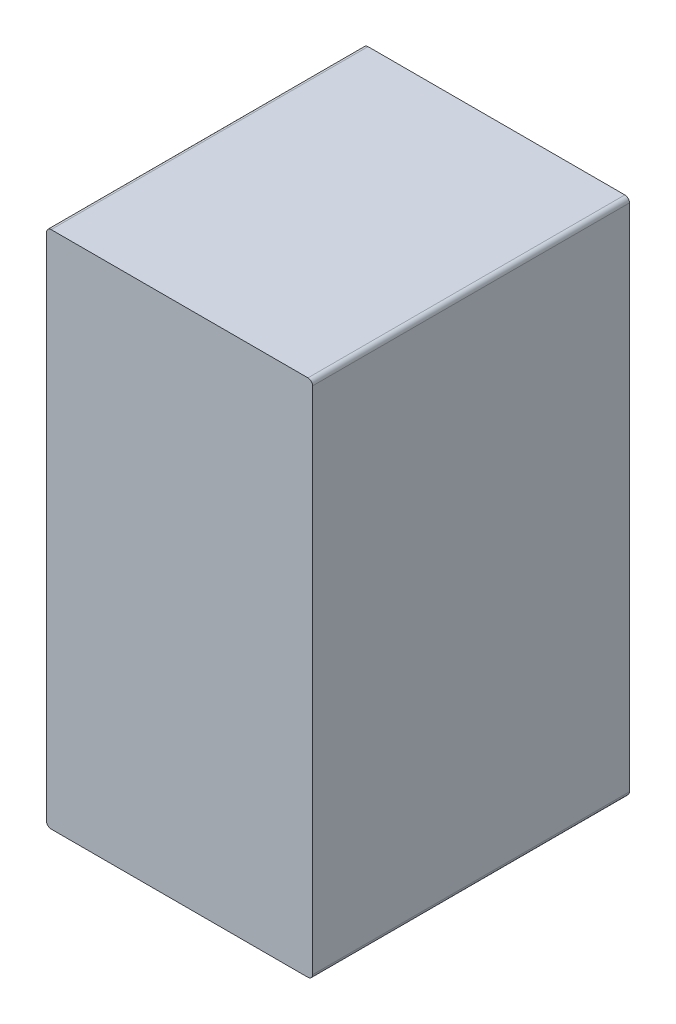
ISO-10303-21;
HEADER;
FILE_DESCRIPTION(('STEP AP214'),'2;1');
FILE_NAME('part.step','',(''),(''),'','','');
FILE_SCHEMA(('AUTOMOTIVE_DESIGN { 1 0 10303 214 1 1 1 1 }'));
ENDSEC;
DATA;
#1=APPLICATION_CONTEXT('core data for automotive mechanical design processes');
#2=APPLICATION_PROTOCOL_DEFINITION('international standard','automotive_design',2000,#1);
#3=PRODUCT_CONTEXT('',#1,'mechanical');
#4=PRODUCT('Part','Part','',(#3));
#5=PRODUCT_RELATED_PRODUCT_CATEGORY('part','',(#4));
#6=PRODUCT_DEFINITION_FORMATION('','',#4);
#7=PRODUCT_DEFINITION_CONTEXT('part definition',#1,'design');
#8=PRODUCT_DEFINITION('design','',#6,#7);
#9=PRODUCT_DEFINITION_SHAPE('','',#8);
#10=(LENGTH_UNIT() NAMED_UNIT(*) SI_UNIT(.MILLI.,.METRE.));
#11=(NAMED_UNIT(*) PLANE_ANGLE_UNIT() SI_UNIT($,.RADIAN.));
#12=(NAMED_UNIT(*) SI_UNIT($,.STERADIAN.) SOLID_ANGLE_UNIT());
#13=UNCERTAINTY_MEASURE_WITH_UNIT(LENGTH_MEASURE(1.E-05),#10,'distance_accuracy_value','');
#14=(GEOMETRIC_REPRESENTATION_CONTEXT(3) GLOBAL_UNCERTAINTY_ASSIGNED_CONTEXT((#13)) GLOBAL_UNIT_ASSIGNED_CONTEXT((#10,
#11,#12)) REPRESENTATION_CONTEXT('',''));
#15=CARTESIAN_POINT('',(0.,0.,0.));
#16=DIRECTION('',(0.,0.,1.));
#17=DIRECTION('',(1.,0.,0.));
#18=AXIS2_PLACEMENT_3D('',#15,#16,#17);
#19=CARTESIAN_POINT('',(69.5,138.,170.));
#20=DIRECTION('',(0.,0.,-1.));
#21=DIRECTION('',(-1.,0.,0.));
#22=AXIS2_PLACEMENT_3D('',#19,#20,#21);
#23=CYLINDRICAL_SURFACE('',#22,2.5);
#24=CARTESIAN_POINT('',(69.5,138.,0.));
#25=DIRECTION('',(0.,0.,1.));
#26=DIRECTION('',(1.,0.,0.));
#27=AXIS2_PLACEMENT_3D('',#24,#25,#26);
#28=CIRCLE('',#27,2.5);
#29=CARTESIAN_POINT('',(69.4999999999999,140.5,0.));
#30=VERTEX_POINT('',#29);
#31=CARTESIAN_POINT('',(72.,138.,0.));
#32=VERTEX_POINT('',#31);
#33=EDGE_CURVE('E198',#30,#32,#28,.F.);
#34=ORIENTED_EDGE('',*,*,#33,.F.);
#35=DIRECTION('',(0.,0.,-1.));
#36=VECTOR('',#35,1.);
#37=CARTESIAN_POINT('',(69.4999999999999,140.5,170.));
#38=LINE('',#37,#36);
#39=CARTESIAN_POINT('',(69.4999999999999,140.5,171.5));
#40=VERTEX_POINT('',#39);
#41=EDGE_CURVE('E11',#40,#30,#38,.T.);
#42=ORIENTED_EDGE('',*,*,#41,.F.);
#43=CARTESIAN_POINT('',(69.5,138.,171.5));
#44=DIRECTION('',(0.,0.,1.));
#45=DIRECTION('',(1.,0.,0.));
#46=AXIS2_PLACEMENT_3D('',#43,#44,#45);
#47=CIRCLE('',#46,2.5);
#48=CARTESIAN_POINT('',(72.,138.,171.5));
#49=VERTEX_POINT('',#48);
#50=EDGE_CURVE('E275',#49,#40,#47,.T.);
#51=ORIENTED_EDGE('',*,*,#50,.F.);
#52=DIRECTION('',(0.,0.,-1.));
#53=VECTOR('',#52,1.);
#54=CARTESIAN_POINT('',(72.,138.,170.));
#55=LINE('',#54,#53);
#56=EDGE_CURVE('E119',#49,#32,#55,.T.);
#57=ORIENTED_EDGE('',*,*,#56,.T.);
#58=EDGE_LOOP('',(#34,#42,#51,#57));
#59=FACE_BOUND('',#58,.T.);
#60=ADVANCED_FACE('F39',(#59),#23,.T.);
#61=CARTESIAN_POINT('',(0.,140.5,170.));
#62=DIRECTION('',(0.,-1.,0.));
#63=DIRECTION('',(0.,0.,-1.));
#64=AXIS2_PLACEMENT_3D('',#61,#62,#63);
#65=PLANE('',#64);
#66=DIRECTION('',(-1.,0.,0.));
#67=VECTOR('',#66,1.);
#68=CARTESIAN_POINT('',(0.,140.5,0.));
#69=LINE('',#68,#67);
#70=CARTESIAN_POINT('',(-69.5,140.5,0.));
#71=VERTEX_POINT('',#70);
#72=EDGE_CURVE('E200',#30,#71,#69,.T.);
#73=ORIENTED_EDGE('',*,*,#72,.T.);
#74=DIRECTION('',(0.,0.,-1.));
#75=VECTOR('',#74,1.);
#76=CARTESIAN_POINT('',(-69.5,140.5,170.));
#77=LINE('',#76,#75);
#78=CARTESIAN_POINT('',(-69.4999999999999,140.5,171.5));
#79=VERTEX_POINT('',#78);
#80=EDGE_CURVE('E49',#79,#71,#77,.T.);
#81=ORIENTED_EDGE('',*,*,#80,.F.);
#82=DIRECTION('',(-1.,0.,0.));
#83=VECTOR('',#82,1.);
#84=CARTESIAN_POINT('',(-69.4999999999999,140.5,171.5));
#85=LINE('',#84,#83);
#86=EDGE_CURVE('E272',#40,#79,#85,.T.);
#87=ORIENTED_EDGE('',*,*,#86,.F.);
#88=ORIENTED_EDGE('',*,*,#41,.T.);
#89=EDGE_LOOP('',(#73,#81,#87,#88));
#90=FACE_BOUND('',#89,.T.);
#91=ADVANCED_FACE('F318',(#90),#65,.F.);
#92=CARTESIAN_POINT('',(-69.5,138.,170.));
#93=DIRECTION('',(0.,0.,-1.));
#94=DIRECTION('',(-1.,0.,0.));
#95=AXIS2_PLACEMENT_3D('',#92,#93,#94);
#96=CYLINDRICAL_SURFACE('',#95,2.5);
#97=CARTESIAN_POINT('',(-69.5,138.,0.));
#98=DIRECTION('',(0.,0.,1.));
#99=DIRECTION('',(1.,0.,0.));
#100=AXIS2_PLACEMENT_3D('',#97,#98,#99);
#101=CIRCLE('',#100,2.5);
#102=CARTESIAN_POINT('',(-72.,138.,0.));
#103=VERTEX_POINT('',#102);
#104=EDGE_CURVE('E203',#103,#71,#101,.F.);
#105=ORIENTED_EDGE('',*,*,#104,.F.);
#106=DIRECTION('',(0.,0.,-1.));
#107=VECTOR('',#106,1.);
#108=CARTESIAN_POINT('',(-72.,138.,170.));
#109=LINE('',#108,#107);
#110=CARTESIAN_POINT('',(-72.,138.,171.5));
#111=VERTEX_POINT('',#110);
#112=EDGE_CURVE('E230',#111,#103,#109,.T.);
#113=ORIENTED_EDGE('',*,*,#112,.F.);
#114=CARTESIAN_POINT('',(-69.5,138.,171.5));
#115=DIRECTION('',(0.,0.,1.));
#116=DIRECTION('',(1.,0.,0.));
#117=AXIS2_PLACEMENT_3D('',#114,#115,#116);
#118=CIRCLE('',#117,2.5);
#119=EDGE_CURVE('E269',#79,#111,#118,.T.);
#120=ORIENTED_EDGE('',*,*,#119,.F.);
#121=ORIENTED_EDGE('',*,*,#80,.T.);
#122=EDGE_LOOP('',(#105,#113,#120,#121));
#123=FACE_BOUND('',#122,.T.);
#124=ADVANCED_FACE('F321',(#123),#96,.T.);
#125=CARTESIAN_POINT('',(-72.,0.,170.));
#126=DIRECTION('',(1.,0.,0.));
#127=DIRECTION('',(0.,0.,-1.));
#128=AXIS2_PLACEMENT_3D('',#125,#126,#127);
#129=PLANE('',#128);
#130=DIRECTION('',(0.,-1.,0.));
#131=VECTOR('',#130,1.);
#132=CARTESIAN_POINT('',(-72.,0.,0.));
#133=LINE('',#132,#131);
#134=CARTESIAN_POINT('',(-72.,-138.,0.));
#135=VERTEX_POINT('',#134);
#136=EDGE_CURVE('E206',#103,#135,#133,.T.);
#137=ORIENTED_EDGE('',*,*,#136,.T.);
#138=DIRECTION('',(0.,0.,-1.));
#139=VECTOR('',#138,1.);
#140=CARTESIAN_POINT('',(-72.,-138.,170.));
#141=LINE('',#140,#139);
#142=CARTESIAN_POINT('',(-72.,-138.,171.5));
#143=VERTEX_POINT('',#142);
#144=EDGE_CURVE('E227',#143,#135,#141,.T.);
#145=ORIENTED_EDGE('',*,*,#144,.F.);
#146=DIRECTION('',(0.,-1.,0.));
#147=VECTOR('',#146,1.);
#148=CARTESIAN_POINT('',(-72.,-138.,171.5));
#149=LINE('',#148,#147);
#150=EDGE_CURVE('E266',#111,#143,#149,.T.);
#151=ORIENTED_EDGE('',*,*,#150,.F.);
#152=ORIENTED_EDGE('',*,*,#112,.T.);
#153=EDGE_LOOP('',(#137,#145,#151,#152));
#154=FACE_BOUND('',#153,.T.);
#155=ADVANCED_FACE('F325',(#154),#129,.F.);
#156=CARTESIAN_POINT('',(-69.5,-138.,170.));
#157=DIRECTION('',(0.,0.,-1.));
#158=DIRECTION('',(-1.,0.,0.));
#159=AXIS2_PLACEMENT_3D('',#156,#157,#158);
#160=CYLINDRICAL_SURFACE('',#159,2.5);
#161=CARTESIAN_POINT('',(-69.5,-138.,0.));
#162=DIRECTION('',(0.,0.,1.));
#163=DIRECTION('',(1.,0.,0.));
#164=AXIS2_PLACEMENT_3D('',#161,#162,#163);
#165=CIRCLE('',#164,2.5);
#166=CARTESIAN_POINT('',(-69.5,-140.5,0.));
#167=VERTEX_POINT('',#166);
#168=EDGE_CURVE('E209',#135,#167,#165,.T.);
#169=ORIENTED_EDGE('',*,*,#168,.T.);
#170=DIRECTION('',(0.,0.,-1.));
#171=VECTOR('',#170,1.);
#172=CARTESIAN_POINT('',(-69.5,-140.5,170.));
#173=LINE('',#172,#171);
#174=CARTESIAN_POINT('',(-69.4999999999999,-140.5,171.5));
#175=VERTEX_POINT('',#174);
#176=EDGE_CURVE('E225',#175,#167,#173,.T.);
#177=ORIENTED_EDGE('',*,*,#176,.F.);
#178=CARTESIAN_POINT('',(-69.5,-138.,171.5));
#179=DIRECTION('',(0.,0.,1.));
#180=DIRECTION('',(-1.,0.,0.));
#181=AXIS2_PLACEMENT_3D('',#178,#179,#180);
#182=CIRCLE('',#181,2.5);
#183=EDGE_CURVE('E263',#143,#175,#182,.T.);
#184=ORIENTED_EDGE('',*,*,#183,.F.);
#185=ORIENTED_EDGE('',*,*,#144,.T.);
#186=EDGE_LOOP('',(#169,#177,#184,#185));
#187=FACE_BOUND('',#186,.T.);
#188=ADVANCED_FACE('F328',(#187),#160,.T.);
#189=CARTESIAN_POINT('',(0.,-140.5,170.));
#190=DIRECTION('',(0.,-1.,0.));
#191=DIRECTION('',(0.,0.,-1.));
#192=AXIS2_PLACEMENT_3D('',#189,#190,#191);
#193=PLANE('',#192);
#194=DIRECTION('',(-1.,0.,0.));
#195=VECTOR('',#194,1.);
#196=CARTESIAN_POINT('',(0.,-140.5,0.));
#197=LINE('',#196,#195);
#198=CARTESIAN_POINT('',(69.4999999999999,-140.5,0.));
#199=VERTEX_POINT('',#198);
#200=EDGE_CURVE('E212',#199,#167,#197,.T.);
#201=ORIENTED_EDGE('',*,*,#200,.F.);
#202=DIRECTION('',(0.,0.,-1.));
#203=VECTOR('',#202,1.);
#204=CARTESIAN_POINT('',(69.4999999999999,-140.5,170.));
#205=LINE('',#204,#203);
#206=CARTESIAN_POINT('',(69.4999999999999,-140.5,171.5));
#207=VERTEX_POINT('',#206);
#208=EDGE_CURVE('E223',#207,#199,#205,.T.);
#209=ORIENTED_EDGE('',*,*,#208,.F.);
#210=DIRECTION('',(1.,0.,0.));
#211=VECTOR('',#210,1.);
#212=CARTESIAN_POINT('',(-69.4999999999999,-140.5,171.5));
#213=LINE('',#212,#211);
#214=EDGE_CURVE('E182',#175,#207,#213,.T.);
#215=ORIENTED_EDGE('',*,*,#214,.F.);
#216=ORIENTED_EDGE('',*,*,#176,.T.);
#217=EDGE_LOOP('',(#201,#209,#215,#216));
#218=FACE_BOUND('',#217,.T.);
#219=ADVANCED_FACE('F329',(#218),#193,.T.);
#220=CARTESIAN_POINT('',(69.5,-138.,170.));
#221=DIRECTION('',(0.,0.,-1.));
#222=DIRECTION('',(-1.,0.,0.));
#223=AXIS2_PLACEMENT_3D('',#220,#221,#222);
#224=CYLINDRICAL_SURFACE('',#223,2.5);
#225=CARTESIAN_POINT('',(69.5,-138.,0.));
#226=DIRECTION('',(0.,0.,1.));
#227=DIRECTION('',(1.,0.,0.));
#228=AXIS2_PLACEMENT_3D('',#225,#226,#227);
#229=CIRCLE('',#228,2.5);
#230=CARTESIAN_POINT('',(72.,-138.,0.));
#231=VERTEX_POINT('',#230);
#232=EDGE_CURVE('E215',#199,#231,#229,.T.);
#233=ORIENTED_EDGE('',*,*,#232,.T.);
#234=DIRECTION('',(0.,0.,-1.));
#235=VECTOR('',#234,1.);
#236=CARTESIAN_POINT('',(72.,-138.,170.));
#237=LINE('',#236,#235);
#238=CARTESIAN_POINT('',(72.,-138.,171.5));
#239=VERTEX_POINT('',#238);
#240=EDGE_CURVE('E111',#239,#231,#237,.T.);
#241=ORIENTED_EDGE('',*,*,#240,.F.);
#242=CARTESIAN_POINT('',(69.5,-138.,171.5));
#243=DIRECTION('',(0.,0.,1.));
#244=DIRECTION('',(1.,0.,0.));
#245=AXIS2_PLACEMENT_3D('',#242,#243,#244);
#246=CIRCLE('',#245,2.5);
#247=EDGE_CURVE('E281',#207,#239,#246,.T.);
#248=ORIENTED_EDGE('',*,*,#247,.F.);
#249=ORIENTED_EDGE('',*,*,#208,.T.);
#250=EDGE_LOOP('',(#233,#241,#248,#249));
#251=FACE_BOUND('',#250,.T.);
#252=ADVANCED_FACE('F292',(#251),#224,.T.);
#253=CARTESIAN_POINT('',(-69.5,138.,170.));
#254=DIRECTION('',(0.,0.,-1.));
#255=DIRECTION('',(-1.,0.,0.));
#256=AXIS2_PLACEMENT_3D('',#253,#254,#255);
#257=CYLINDRICAL_SURFACE('',#256,1.);
#258=CARTESIAN_POINT('',(-69.5,138.,0.));
#259=DIRECTION('',(0.,0.,1.));
#260=DIRECTION('',(1.,0.,0.));
#261=AXIS2_PLACEMENT_3D('',#258,#259,#260);
#262=CIRCLE('',#261,1.);
#263=CARTESIAN_POINT('',(-70.5,138.,0.));
#264=VERTEX_POINT('',#263);
#265=CARTESIAN_POINT('',(-69.5,139.,0.));
#266=VERTEX_POINT('',#265);
#267=EDGE_CURVE('E178',#264,#266,#262,.F.);
#268=ORIENTED_EDGE('',*,*,#267,.T.);
#269=DIRECTION('',(0.,0.,-1.));
#270=VECTOR('',#269,1.);
#271=CARTESIAN_POINT('',(-69.5,139.,170.));
#272=LINE('',#271,#270);
#273=CARTESIAN_POINT('',(-69.5,139.,170.));
#274=VERTEX_POINT('',#273);
#275=EDGE_CURVE('E43',#274,#266,#272,.T.);
#276=ORIENTED_EDGE('',*,*,#275,.F.);
#277=CARTESIAN_POINT('',(-69.5,138.,170.));
#278=DIRECTION('',(0.,0.,1.));
#279=DIRECTION('',(1.,0.,0.));
#280=AXIS2_PLACEMENT_3D('',#277,#278,#279);
#281=CIRCLE('',#280,1.);
#282=CARTESIAN_POINT('',(-70.5,138.,170.));
#283=VERTEX_POINT('',#282);
#284=EDGE_CURVE('E220',#283,#274,#281,.F.);
#285=ORIENTED_EDGE('',*,*,#284,.F.);
#286=DIRECTION('',(0.,0.,-1.));
#287=VECTOR('',#286,1.);
#288=CARTESIAN_POINT('',(-70.5,138.,170.));
#289=LINE('',#288,#287);
#290=EDGE_CURVE('E177',#283,#264,#289,.T.);
#291=ORIENTED_EDGE('',*,*,#290,.T.);
#292=EDGE_LOOP('',(#268,#276,#285,#291));
#293=FACE_BOUND('',#292,.T.);
#294=ADVANCED_FACE('F41',(#293),#257,.F.);
#295=CARTESIAN_POINT('',(0.,139.,170.));
#296=DIRECTION('',(0.,1.,0.));
#297=DIRECTION('',(0.,0.,1.));
#298=AXIS2_PLACEMENT_3D('',#295,#296,#297);
#299=PLANE('',#298);
#300=DIRECTION('',(1.,0.,0.));
#301=VECTOR('',#300,1.);
#302=CARTESIAN_POINT('',(0.,139.,0.));
#303=LINE('',#302,#301);
#304=CARTESIAN_POINT('',(69.5,139.,0.));
#305=VERTEX_POINT('',#304);
#306=EDGE_CURVE('E181',#266,#305,#303,.T.);
#307=ORIENTED_EDGE('',*,*,#306,.T.);
#308=DIRECTION('',(0.,0.,-1.));
#309=VECTOR('',#308,1.);
#310=CARTESIAN_POINT('',(69.5,139.,170.));
#311=LINE('',#310,#309);
#312=CARTESIAN_POINT('',(69.5,139.,170.));
#313=VERTEX_POINT('',#312);
#314=EDGE_CURVE('E239',#313,#305,#311,.T.);
#315=ORIENTED_EDGE('',*,*,#314,.F.);
#316=DIRECTION('',(1.,0.,0.));
#317=VECTOR('',#316,1.);
#318=CARTESIAN_POINT('',(0.,139.,170.));
#319=LINE('',#318,#317);
#320=EDGE_CURVE('E128',#274,#313,#319,.T.);
#321=ORIENTED_EDGE('',*,*,#320,.F.);
#322=ORIENTED_EDGE('',*,*,#275,.T.);
#323=EDGE_LOOP('',(#307,#315,#321,#322));
#324=FACE_BOUND('',#323,.T.);
#325=ADVANCED_FACE('F244',(#324),#299,.F.);
#326=CARTESIAN_POINT('',(69.5,138.,170.));
#327=DIRECTION('',(0.,0.,-1.));
#328=DIRECTION('',(-1.,0.,0.));
#329=AXIS2_PLACEMENT_3D('',#326,#327,#328);
#330=CYLINDRICAL_SURFACE('',#329,1.);
#331=CARTESIAN_POINT('',(69.5,138.,0.));
#332=DIRECTION('',(0.,0.,1.));
#333=DIRECTION('',(1.,0.,0.));
#334=AXIS2_PLACEMENT_3D('',#331,#332,#333);
#335=CIRCLE('',#334,1.);
#336=CARTESIAN_POINT('',(70.5,138.,0.));
#337=VERTEX_POINT('',#336);
#338=EDGE_CURVE('E184',#305,#337,#335,.F.);
#339=ORIENTED_EDGE('',*,*,#338,.T.);
#340=DIRECTION('',(0.,0.,-1.));
#341=VECTOR('',#340,1.);
#342=CARTESIAN_POINT('',(70.5,138.,170.));
#343=LINE('',#342,#341);
#344=CARTESIAN_POINT('',(70.5,138.,170.));
#345=VERTEX_POINT('',#344);
#346=EDGE_CURVE('E238',#345,#337,#343,.T.);
#347=ORIENTED_EDGE('',*,*,#346,.F.);
#348=CARTESIAN_POINT('',(69.5,138.,170.));
#349=DIRECTION('',(0.,0.,1.));
#350=DIRECTION('',(1.,0.,0.));
#351=AXIS2_PLACEMENT_3D('',#348,#349,#350);
#352=CIRCLE('',#351,1.);
#353=EDGE_CURVE('E170',#313,#345,#352,.F.);
#354=ORIENTED_EDGE('',*,*,#353,.F.);
#355=ORIENTED_EDGE('',*,*,#314,.T.);
#356=EDGE_LOOP('',(#339,#347,#354,#355));
#357=FACE_BOUND('',#356,.T.);
#358=ADVANCED_FACE('F255',(#357),#330,.F.);
#359=CARTESIAN_POINT('',(70.5,0.,170.));
#360=DIRECTION('',(-1.,0.,0.));
#361=DIRECTION('',(0.,0.,1.));
#362=AXIS2_PLACEMENT_3D('',#359,#360,#361);
#363=PLANE('',#362);
#364=DIRECTION('',(0.,1.,0.));
#365=VECTOR('',#364,1.);
#366=CARTESIAN_POINT('',(70.5,0.,0.));
#367=LINE('',#366,#365);
#368=CARTESIAN_POINT('',(70.5,-138.,0.));
#369=VERTEX_POINT('',#368);
#370=EDGE_CURVE('E187',#369,#337,#367,.T.);
#371=ORIENTED_EDGE('',*,*,#370,.F.);
#372=DIRECTION('',(0.,0.,-1.));
#373=VECTOR('',#372,1.);
#374=CARTESIAN_POINT('',(70.5,-138.,170.));
#375=LINE('',#374,#373);
#376=CARTESIAN_POINT('',(70.5,-138.,170.));
#377=VERTEX_POINT('',#376);
#378=EDGE_CURVE('E154',#377,#369,#375,.T.);
#379=ORIENTED_EDGE('',*,*,#378,.F.);
#380=DIRECTION('',(0.,1.,0.));
#381=VECTOR('',#380,1.);
#382=CARTESIAN_POINT('',(70.5,0.,170.));
#383=LINE('',#382,#381);
#384=EDGE_CURVE('E168',#377,#345,#383,.T.);
#385=ORIENTED_EDGE('',*,*,#384,.T.);
#386=ORIENTED_EDGE('',*,*,#346,.T.);
#387=EDGE_LOOP('',(#371,#379,#385,#386));
#388=FACE_BOUND('',#387,.T.);
#389=ADVANCED_FACE('F257',(#388),#363,.T.);
#390=CARTESIAN_POINT('',(69.5,-138.,170.));
#391=DIRECTION('',(0.,0.,-1.));
#392=DIRECTION('',(-1.,0.,0.));
#393=AXIS2_PLACEMENT_3D('',#390,#391,#392);
#394=CYLINDRICAL_SURFACE('',#393,1.);
#395=CARTESIAN_POINT('',(69.5,-138.,0.));
#396=DIRECTION('',(0.,0.,1.));
#397=DIRECTION('',(1.,0.,0.));
#398=AXIS2_PLACEMENT_3D('',#395,#396,#397);
#399=CIRCLE('',#398,1.);
#400=CARTESIAN_POINT('',(69.5,-139.,0.));
#401=VERTEX_POINT('',#400);
#402=EDGE_CURVE('E150',#401,#369,#399,.T.);
#403=ORIENTED_EDGE('',*,*,#402,.F.);
#404=DIRECTION('',(0.,0.,-1.));
#405=VECTOR('',#404,1.);
#406=CARTESIAN_POINT('',(69.5,-139.,170.));
#407=LINE('',#406,#405);
#408=CARTESIAN_POINT('',(69.5,-139.,170.));
#409=VERTEX_POINT('',#408);
#410=EDGE_CURVE('E143',#409,#401,#407,.T.);
#411=ORIENTED_EDGE('',*,*,#410,.F.);
#412=CARTESIAN_POINT('',(69.5,-138.,170.));
#413=DIRECTION('',(0.,0.,1.));
#414=DIRECTION('',(1.,0.,0.));
#415=AXIS2_PLACEMENT_3D('',#412,#413,#414);
#416=CIRCLE('',#415,1.);
#417=EDGE_CURVE('E147',#409,#377,#416,.T.);
#418=ORIENTED_EDGE('',*,*,#417,.T.);
#419=ORIENTED_EDGE('',*,*,#378,.T.);
#420=EDGE_LOOP('',(#403,#411,#418,#419));
#421=FACE_BOUND('',#420,.T.);
#422=ADVANCED_FACE('F145',(#421),#394,.F.);
#423=CARTESIAN_POINT('',(0.,-139.,170.));
#424=DIRECTION('',(0.,1.,0.));
#425=DIRECTION('',(0.,0.,1.));
#426=AXIS2_PLACEMENT_3D('',#423,#424,#425);
#427=PLANE('',#426);
#428=DIRECTION('',(1.,0.,0.));
#429=VECTOR('',#428,1.);
#430=CARTESIAN_POINT('',(0.,-139.,0.));
#431=LINE('',#430,#429);
#432=CARTESIAN_POINT('',(-69.5,-139.,0.));
#433=VERTEX_POINT('',#432);
#434=EDGE_CURVE('E191',#433,#401,#431,.T.);
#435=ORIENTED_EDGE('',*,*,#434,.F.);
#436=DIRECTION('',(0.,0.,-1.));
#437=VECTOR('',#436,1.);
#438=CARTESIAN_POINT('',(-69.5,-139.,170.));
#439=LINE('',#438,#437);
#440=CARTESIAN_POINT('',(-69.5,-139.,170.));
#441=VERTEX_POINT('',#440);
#442=EDGE_CURVE('E155',#441,#433,#439,.T.);
#443=ORIENTED_EDGE('',*,*,#442,.F.);
#444=DIRECTION('',(1.,0.,0.));
#445=VECTOR('',#444,1.);
#446=CARTESIAN_POINT('',(0.,-139.,170.));
#447=LINE('',#446,#445);
#448=EDGE_CURVE('E158',#441,#409,#447,.T.);
#449=ORIENTED_EDGE('',*,*,#448,.T.);
#450=ORIENTED_EDGE('',*,*,#410,.T.);
#451=EDGE_LOOP('',(#435,#443,#449,#450));
#452=FACE_BOUND('',#451,.T.);
#453=ADVANCED_FACE('F159',(#452),#427,.T.);
#454=CARTESIAN_POINT('',(-69.5,-138.,170.));
#455=DIRECTION('',(0.,0.,-1.));
#456=DIRECTION('',(-1.,0.,0.));
#457=AXIS2_PLACEMENT_3D('',#454,#455,#456);
#458=CYLINDRICAL_SURFACE('',#457,1.);
#459=CARTESIAN_POINT('',(-69.5,-138.,0.));
#460=DIRECTION('',(0.,0.,1.));
#461=DIRECTION('',(1.,0.,0.));
#462=AXIS2_PLACEMENT_3D('',#459,#460,#461);
#463=CIRCLE('',#462,1.);
#464=CARTESIAN_POINT('',(-70.5,-138.,0.));
#465=VERTEX_POINT('',#464);
#466=EDGE_CURVE('E193',#465,#433,#463,.T.);
#467=ORIENTED_EDGE('',*,*,#466,.F.);
#468=DIRECTION('',(0.,0.,-1.));
#469=VECTOR('',#468,1.);
#470=CARTESIAN_POINT('',(-70.5,-138.,170.));
#471=LINE('',#470,#469);
#472=CARTESIAN_POINT('',(-70.5,-138.,170.));
#473=VERTEX_POINT('',#472);
#474=EDGE_CURVE('E58',#473,#465,#471,.T.);
#475=ORIENTED_EDGE('',*,*,#474,.F.);
#476=CARTESIAN_POINT('',(-69.5,-138.,170.));
#477=DIRECTION('',(0.,0.,1.));
#478=DIRECTION('',(1.,0.,0.));
#479=AXIS2_PLACEMENT_3D('',#476,#477,#478);
#480=CIRCLE('',#479,1.);
#481=EDGE_CURVE('E162',#473,#441,#480,.T.);
#482=ORIENTED_EDGE('',*,*,#481,.T.);
#483=ORIENTED_EDGE('',*,*,#442,.T.);
#484=EDGE_LOOP('',(#467,#475,#482,#483));
#485=FACE_BOUND('',#484,.T.);
#486=ADVANCED_FACE('F349',(#485),#458,.F.);
#487=CARTESIAN_POINT('',(-70.5,0.,170.));
#488=DIRECTION('',(-1.,0.,0.));
#489=DIRECTION('',(0.,0.,1.));
#490=AXIS2_PLACEMENT_3D('',#487,#488,#489);
#491=PLANE('',#490);
#492=DIRECTION('',(0.,1.,0.));
#493=VECTOR('',#492,1.);
#494=CARTESIAN_POINT('',(-70.5,0.,0.));
#495=LINE('',#494,#493);
#496=EDGE_CURVE('E196',#465,#264,#495,.T.);
#497=ORIENTED_EDGE('',*,*,#496,.T.);
#498=ORIENTED_EDGE('',*,*,#290,.F.);
#499=DIRECTION('',(0.,1.,0.));
#500=VECTOR('',#499,1.);
#501=CARTESIAN_POINT('',(-70.5,0.,170.));
#502=LINE('',#501,#500);
#503=EDGE_CURVE('E175',#473,#283,#502,.T.);
#504=ORIENTED_EDGE('',*,*,#503,.F.);
#505=ORIENTED_EDGE('',*,*,#474,.T.);
#506=EDGE_LOOP('',(#497,#498,#504,#505));
#507=FACE_BOUND('',#506,.T.);
#508=ADVANCED_FACE('F346',(#507),#491,.F.);
#509=CARTESIAN_POINT('',(72.,0.,170.));
#510=DIRECTION('',(1.,0.,0.));
#511=DIRECTION('',(0.,0.,-1.));
#512=AXIS2_PLACEMENT_3D('',#509,#510,#511);
#513=PLANE('',#512);
#514=DIRECTION('',(0.,-1.,0.));
#515=VECTOR('',#514,1.);
#516=CARTESIAN_POINT('',(72.,0.,0.));
#517=LINE('',#516,#515);
#518=EDGE_CURVE('E217',#32,#231,#517,.T.);
#519=ORIENTED_EDGE('',*,*,#518,.F.);
#520=ORIENTED_EDGE('',*,*,#56,.F.);
#521=DIRECTION('',(0.,1.,0.));
#522=VECTOR('',#521,1.);
#523=CARTESIAN_POINT('',(72.,-138.,171.5));
#524=LINE('',#523,#522);
#525=EDGE_CURVE('E278',#239,#49,#524,.T.);
#526=ORIENTED_EDGE('',*,*,#525,.F.);
#527=ORIENTED_EDGE('',*,*,#240,.T.);
#528=EDGE_LOOP('',(#519,#520,#526,#527));
#529=FACE_BOUND('',#528,.T.);
#530=ADVANCED_FACE('F313',(#529),#513,.T.);
#531=CARTESIAN_POINT('',(0.,0.,0.));
#532=DIRECTION('',(0.,0.,1.));
#533=DIRECTION('',(1.,0.,0.));
#534=AXIS2_PLACEMENT_3D('',#531,#532,#533);
#535=PLANE('',#534);
#536=ORIENTED_EDGE('',*,*,#267,.F.);
#537=ORIENTED_EDGE('',*,*,#496,.F.);
#538=ORIENTED_EDGE('',*,*,#466,.T.);
#539=ORIENTED_EDGE('',*,*,#434,.T.);
#540=ORIENTED_EDGE('',*,*,#402,.T.);
#541=ORIENTED_EDGE('',*,*,#370,.T.);
#542=ORIENTED_EDGE('',*,*,#338,.F.);
#543=ORIENTED_EDGE('',*,*,#306,.F.);
#544=EDGE_LOOP('',(#536,#537,#538,#539,#540,#541,#542,#543));
#545=FACE_BOUND('',#544,.T.);
#546=ORIENTED_EDGE('',*,*,#33,.T.);
#547=ORIENTED_EDGE('',*,*,#518,.T.);
#548=ORIENTED_EDGE('',*,*,#232,.F.);
#549=ORIENTED_EDGE('',*,*,#200,.T.);
#550=ORIENTED_EDGE('',*,*,#168,.F.);
#551=ORIENTED_EDGE('',*,*,#136,.F.);
#552=ORIENTED_EDGE('',*,*,#104,.T.);
#553=ORIENTED_EDGE('',*,*,#72,.F.);
#554=EDGE_LOOP('',(#546,#547,#548,#549,#550,#551,#552,#553));
#555=FACE_BOUND('',#554,.T.);
#556=ADVANCED_FACE('F252',(#545,#555),#535,.F.);
#557=CARTESIAN_POINT('',(69.5,-138.,170.));
#558=DIRECTION('',(0.,0.,1.));
#559=DIRECTION('',(1.,0.,0.));
#560=AXIS2_PLACEMENT_3D('',#557,#558,#559);
#561=PLANE('',#560);
#562=ORIENTED_EDGE('',*,*,#503,.T.);
#563=ORIENTED_EDGE('',*,*,#284,.T.);
#564=ORIENTED_EDGE('',*,*,#320,.T.);
#565=ORIENTED_EDGE('',*,*,#353,.T.);
#566=ORIENTED_EDGE('',*,*,#384,.F.);
#567=ORIENTED_EDGE('',*,*,#417,.F.);
#568=ORIENTED_EDGE('',*,*,#448,.F.);
#569=ORIENTED_EDGE('',*,*,#481,.F.);
#570=EDGE_LOOP('',(#562,#563,#564,#565,#566,#567,#568,#569));
#571=FACE_BOUND('',#570,.T.);
#572=ADVANCED_FACE('F165',(#571),#561,.F.);
#573=CARTESIAN_POINT('',(69.5,-138.,171.5));
#574=DIRECTION('',(0.,0.,1.));
#575=DIRECTION('',(1.,0.,0.));
#576=AXIS2_PLACEMENT_3D('',#573,#574,#575);
#577=PLANE('',#576);
#578=ORIENTED_EDGE('',*,*,#247,.T.);
#579=ORIENTED_EDGE('',*,*,#525,.T.);
#580=ORIENTED_EDGE('',*,*,#50,.T.);
#581=ORIENTED_EDGE('',*,*,#86,.T.);
#582=ORIENTED_EDGE('',*,*,#119,.T.);
#583=ORIENTED_EDGE('',*,*,#150,.T.);
#584=ORIENTED_EDGE('',*,*,#183,.T.);
#585=ORIENTED_EDGE('',*,*,#214,.T.);
#586=EDGE_LOOP('',(#578,#579,#580,#581,#582,#583,#584,#585));
#587=FACE_BOUND('',#586,.T.);
#588=ADVANCED_FACE('F286',(#587),#577,.T.);
#589=CLOSED_SHELL('',(#60,#91,#124,#155,#188,#219,#252,#294,#325,#358,#389,#422,#453,#486,#508,
#530,#556,#572,#588));
#590=MANIFOLD_SOLID_BREP('B2',#589);
#591=ADVANCED_BREP_SHAPE_REPRESENTATION('',(#18,#590),#14);
#592=SHAPE_DEFINITION_REPRESENTATION(#9,#591);
ENDSEC;
END-ISO-10303-21;
